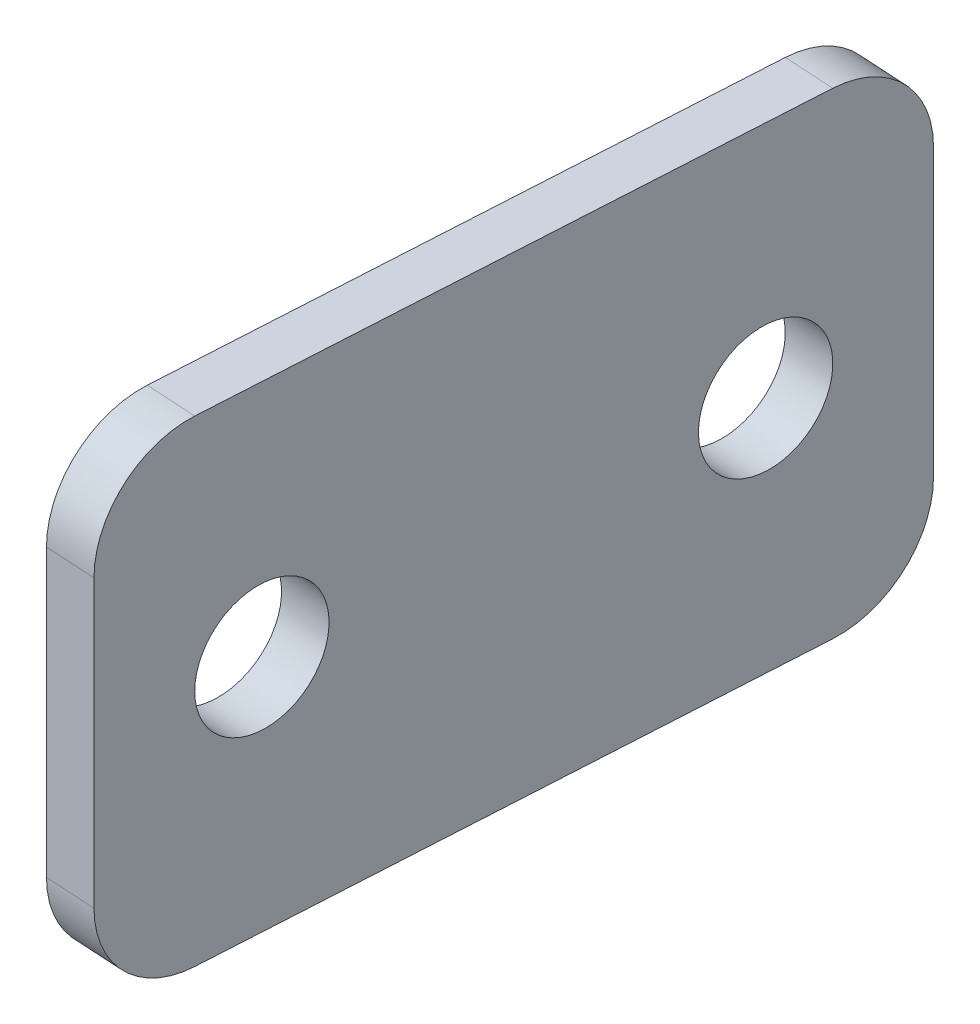
ISO-10303-21;
HEADER;
FILE_DESCRIPTION(('STEP AP214'),'2;1');
FILE_NAME('part.step','',(''),(''),'','','');
FILE_SCHEMA(('AUTOMOTIVE_DESIGN { 1 0 10303 214 1 1 1 1 }'));
ENDSEC;
DATA;
#1=APPLICATION_CONTEXT('core data for automotive mechanical design processes');
#2=APPLICATION_PROTOCOL_DEFINITION('international standard','automotive_design',2000,#1);
#3=PRODUCT_CONTEXT('',#1,'mechanical');
#4=PRODUCT('Part','Part','',(#3));
#5=PRODUCT_RELATED_PRODUCT_CATEGORY('part','',(#4));
#6=PRODUCT_DEFINITION_FORMATION('','',#4);
#7=PRODUCT_DEFINITION_CONTEXT('part definition',#1,'design');
#8=PRODUCT_DEFINITION('design','',#6,#7);
#9=PRODUCT_DEFINITION_SHAPE('','',#8);
#10=(LENGTH_UNIT() NAMED_UNIT(*) SI_UNIT(.MILLI.,.METRE.));
#11=(NAMED_UNIT(*) PLANE_ANGLE_UNIT() SI_UNIT($,.RADIAN.));
#12=(NAMED_UNIT(*) SI_UNIT($,.STERADIAN.) SOLID_ANGLE_UNIT());
#13=UNCERTAINTY_MEASURE_WITH_UNIT(LENGTH_MEASURE(1.E-05),#10,'distance_accuracy_value','');
#14=(GEOMETRIC_REPRESENTATION_CONTEXT(3) GLOBAL_UNCERTAINTY_ASSIGNED_CONTEXT((#13)) GLOBAL_UNIT_ASSIGNED_CONTEXT((#10,
#11,#12)) REPRESENTATION_CONTEXT('',''));
#15=CARTESIAN_POINT('',(0.,0.,0.));
#16=DIRECTION('',(0.,0.,1.));
#17=DIRECTION('',(1.,0.,0.));
#18=AXIS2_PLACEMENT_3D('',#15,#16,#17);
#19=CARTESIAN_POINT('',(434.33990829078,-447.019503363955,-696.124818091149));
#20=DIRECTION('',(-0.998302940921257,0.,-0.0582343382204065));
#21=DIRECTION('',(-0.0582343382204065,0.,0.998302940921257));
#22=AXIS2_PLACEMENT_3D('',#19,#20,#21);
#23=PLANE('',#22);
#24=CARTESIAN_POINT('',(418.058904953613,-451.519503363955,-417.021903739721));
#25=DIRECTION('',(-0.998302940921257,0.,-0.0582343382204065));
#26=DIRECTION('',(-0.0582343382204065,0.,0.998302940921257));
#27=AXIS2_PLACEMENT_3D('',#24,#25,#26);
#28=CIRCLE('',#27,3.);
#29=CARTESIAN_POINT('',(418.058904953613,-454.519503363955,-417.021903739721));
#30=VERTEX_POINT('',#29);
#31=CARTESIAN_POINT('',(417.884201938952,-451.519503363955,-414.026994916957));
#32=VERTEX_POINT('',#31);
#33=EDGE_CURVE('E115',#30,#32,#28,.T.);
#34=ORIENTED_EDGE('',*,*,#33,.F.);
#35=DIRECTION('',(-0.0582343382204181,0.,0.998302940921256));
#36=VECTOR('',#35,1.);
#37=CARTESIAN_POINT('',(419.165357379801,-454.519503363955,-435.989659617225));
#38=LINE('',#37,#36);
#39=CARTESIAN_POINT('',(419.165357379801,-454.519503363955,-435.989659617225));
#40=VERTEX_POINT('',#39);
#41=EDGE_CURVE('E118',#40,#30,#38,.T.);
#42=ORIENTED_EDGE('',*,*,#41,.F.);
#43=CARTESIAN_POINT('',(419.165357379801,-451.519503363955,-435.989659617225));
#44=DIRECTION('',(-0.998302940921257,0.,-0.0582343382204065));
#45=DIRECTION('',(-0.0582343382204065,0.,0.998302940921257));
#46=AXIS2_PLACEMENT_3D('',#43,#44,#45);
#47=CIRCLE('',#46,3.);
#48=CARTESIAN_POINT('',(419.340060394462,-451.519503363955,-438.984568439988));
#49=VERTEX_POINT('',#48);
#50=EDGE_CURVE('E98',#49,#40,#47,.T.);
#51=ORIENTED_EDGE('',*,*,#50,.F.);
#52=DIRECTION('',(0.,1.,0.));
#53=VECTOR('',#52,1.);
#54=CARTESIAN_POINT('',(419.340060394462,-454.519503363955,-438.984568439988));
#55=LINE('',#54,#53);
#56=CARTESIAN_POINT('',(419.340060394462,-442.519503363955,-438.984568439988));
#57=VERTEX_POINT('',#56);
#58=EDGE_CURVE('E94',#57,#49,#55,.F.);
#59=ORIENTED_EDGE('',*,*,#58,.F.);
#60=CARTESIAN_POINT('',(419.165357379801,-442.519503363955,-435.989659617225));
#61=DIRECTION('',(-0.998302940921257,0.,-0.0582343382204065));
#62=DIRECTION('',(-0.0582343382204065,0.,0.998302940921257));
#63=AXIS2_PLACEMENT_3D('',#60,#61,#62);
#64=CIRCLE('',#63,3.);
#65=CARTESIAN_POINT('',(419.165357379801,-439.519503363955,-435.989659617225));
#66=VERTEX_POINT('',#65);
#67=EDGE_CURVE('E83',#66,#57,#64,.T.);
#68=ORIENTED_EDGE('',*,*,#67,.F.);
#69=DIRECTION('',(0.0582343382204181,0.,-0.998302940921256));
#70=VECTOR('',#69,1.);
#71=CARTESIAN_POINT('',(418.058904953613,-439.519503363955,-417.021903739721));
#72=LINE('',#71,#70);
#73=CARTESIAN_POINT('',(418.058904953613,-439.519503363955,-417.021903739721));
#74=VERTEX_POINT('',#73);
#75=EDGE_CURVE('E78',#74,#66,#72,.T.);
#76=ORIENTED_EDGE('',*,*,#75,.F.);
#77=CARTESIAN_POINT('',(418.058904953613,-442.519503363955,-417.021903739721));
#78=DIRECTION('',(0.998302940921257,0.,0.0582343382204065));
#79=DIRECTION('',(0.0582343382204065,0.,-0.998302940921257));
#80=AXIS2_PLACEMENT_3D('',#77,#78,#79);
#81=CIRCLE('',#80,3.);
#82=CARTESIAN_POINT('',(417.884201938952,-442.519503363955,-414.026994916957));
#83=VERTEX_POINT('',#82);
#84=EDGE_CURVE('E138',#83,#74,#81,.F.);
#85=ORIENTED_EDGE('',*,*,#84,.F.);
#86=DIRECTION('',(0.,1.,0.));
#87=VECTOR('',#86,1.);
#88=CARTESIAN_POINT('',(417.884201938952,-439.519503363955,-414.026994916957));
#89=LINE('',#88,#87);
#90=EDGE_CURVE('E112',#32,#83,#89,.T.);
#91=ORIENTED_EDGE('',*,*,#90,.F.);
#92=EDGE_LOOP('',(#34,#42,#51,#59,#68,#76,#85,#91));
#93=FACE_BOUND('',#92,.T.);
#94=CARTESIAN_POINT('',(419.04888870336,-447.019503363955,-433.993053735382));
#95=DIRECTION('',(-0.998302940921257,0.,-0.0582343382204065));
#96=DIRECTION('',(-0.0582343382204065,0.,0.998302940921257));
#97=AXIS2_PLACEMENT_3D('',#94,#95,#96);
#98=CIRCLE('',#97,2.);
#99=CARTESIAN_POINT('',(418.932420026919,-447.019503363955,-431.996447853539));
#100=VERTEX_POINT('',#99);
#101=EDGE_CURVE('E117',#100,#100,#98,.T.);
#102=ORIENTED_EDGE('',*,*,#101,.T.);
#103=EDGE_LOOP('',(#102));
#104=FACE_BOUND('',#103,.T.);
#105=CARTESIAN_POINT('',(418.175373630054,-447.019503363955,-419.018509621563));
#106=DIRECTION('',(-0.998302940921257,0.,-0.0582343382204065));
#107=DIRECTION('',(-0.0582343382204065,0.,0.998302940921257));
#108=AXIS2_PLACEMENT_3D('',#105,#106,#107);
#109=CIRCLE('',#108,2.);
#110=CARTESIAN_POINT('',(418.058904953613,-447.019503363955,-417.02190373972));
#111=VERTEX_POINT('',#110);
#112=EDGE_CURVE('E20',#111,#111,#109,.T.);
#113=ORIENTED_EDGE('',*,*,#112,.T.);
#114=EDGE_LOOP('',(#113));
#115=FACE_BOUND('',#114,.T.);
#116=ADVANCED_FACE('F17',(#93,#104,#115),#23,.F.);
#117=CARTESIAN_POINT('',(418.175373630054,-447.019503363955,-419.018509621563));
#118=DIRECTION('',(-0.998302940921257,0.,-0.0582343382204065));
#119=DIRECTION('',(-0.0582343382204065,0.,0.998302940921257));
#120=AXIS2_PLACEMENT_3D('',#117,#118,#119);
#121=CYLINDRICAL_SURFACE('',#120,2.);
#122=ORIENTED_EDGE('',*,*,#112,.F.);
#123=EDGE_LOOP('',(#122));
#124=FACE_BOUND('',#123,.T.);
#125=CARTESIAN_POINT('',(416.588071953989,-447.019503363955,-419.111102219333));
#126=DIRECTION('',(-0.998302940921257,0.,-0.0582343382204065));
#127=DIRECTION('',(-0.0582343382204065,0.,0.998302940921257));
#128=AXIS2_PLACEMENT_3D('',#125,#126,#127);
#129=CIRCLE('',#128,2.);
#130=CARTESIAN_POINT('',(416.471603277548,-447.019503363955,-417.114496337491));
#131=VERTEX_POINT('',#130);
#132=EDGE_CURVE('E135',#131,#131,#129,.F.);
#133=ORIENTED_EDGE('',*,*,#132,.F.);
#134=EDGE_LOOP('',(#133));
#135=FACE_BOUND('',#134,.T.);
#136=ADVANCED_FACE('F149',(#124,#135),#121,.F.);
#137=CARTESIAN_POINT('',(419.04888870336,-447.019503363955,-433.993053735382));
#138=DIRECTION('',(-0.998302940921257,0.,-0.0582343382204065));
#139=DIRECTION('',(-0.0582343382204065,0.,0.998302940921257));
#140=AXIS2_PLACEMENT_3D('',#137,#138,#139);
#141=CYLINDRICAL_SURFACE('',#140,2.);
#142=ORIENTED_EDGE('',*,*,#101,.F.);
#143=EDGE_LOOP('',(#142));
#144=FACE_BOUND('',#143,.T.);
#145=CARTESIAN_POINT('',(417.461587027295,-447.019503363955,-434.085646333152));
#146=DIRECTION('',(-0.998302940921257,0.,-0.0582343382204065));
#147=DIRECTION('',(-0.0582343382204065,0.,0.998302940921257));
#148=AXIS2_PLACEMENT_3D('',#145,#146,#147);
#149=CIRCLE('',#148,2.);
#150=CARTESIAN_POINT('',(417.345118350854,-447.019503363955,-432.08904045131));
#151=VERTEX_POINT('',#150);
#152=EDGE_CURVE('E132',#151,#151,#149,.F.);
#153=ORIENTED_EDGE('',*,*,#152,.F.);
#154=EDGE_LOOP('',(#153));
#155=FACE_BOUND('',#154,.T.);
#156=ADVANCED_FACE('F152',(#144,#155),#141,.F.);
#157=CARTESIAN_POINT('',(419.340060394462,-439.519503363955,-438.984568439988));
#158=DIRECTION('',(0.,1.,0.));
#159=DIRECTION('',(0.,0.,1.));
#160=AXIS2_PLACEMENT_3D('',#157,#158,#159);
#161=PLANE('',#160);
#162=DIRECTION('',(-0.998302940921257,0.,-0.0582343382204065));
#163=VECTOR('',#162,1.);
#164=CARTESIAN_POINT('',(419.165357379801,-439.519503363955,-435.989659617225));
#165=LINE('',#164,#163);
#166=CARTESIAN_POINT('',(417.578055703736,-439.519503363955,-436.082252214995));
#167=VERTEX_POINT('',#166);
#168=EDGE_CURVE('E90',#167,#66,#165,.F.);
#169=ORIENTED_EDGE('',*,*,#168,.F.);
#170=DIRECTION('',(-0.0582343382204065,0.,0.998302940921257));
#171=VECTOR('',#170,1.);
#172=CARTESIAN_POINT('',(432.752606614715,-439.519503363955,-696.217410688919));
#173=LINE('',#172,#171);
#174=CARTESIAN_POINT('',(416.471603277549,-439.519503363955,-417.114496337491));
#175=VERTEX_POINT('',#174);
#176=EDGE_CURVE('E131',#175,#167,#173,.F.);
#177=ORIENTED_EDGE('',*,*,#176,.F.);
#178=DIRECTION('',(0.998302940921257,0.,0.0582343382204065));
#179=VECTOR('',#178,1.);
#180=CARTESIAN_POINT('',(418.058904953613,-439.519503363955,-417.021903739721));
#181=LINE('',#180,#179);
#182=EDGE_CURVE('E279',#74,#175,#181,.F.);
#183=ORIENTED_EDGE('',*,*,#182,.F.);
#184=ORIENTED_EDGE('',*,*,#75,.T.);
#185=EDGE_LOOP('',(#169,#177,#183,#184));
#186=FACE_BOUND('',#185,.T.);
#187=ADVANCED_FACE('F188',(#186),#161,.T.);
#188=CARTESIAN_POINT('',(419.165357379801,-442.519503363955,-435.989659617225));
#189=DIRECTION('',(-0.998302940921257,0.,-0.0582343382204065));
#190=DIRECTION('',(-0.0582343382204065,0.,0.998302940921257));
#191=AXIS2_PLACEMENT_3D('',#188,#189,#190);
#192=CYLINDRICAL_SURFACE('',#191,3.);
#193=DIRECTION('',(-0.998302940921257,0.,-0.0582343382204065));
#194=VECTOR('',#193,1.);
#195=CARTESIAN_POINT('',(419.340060394462,-442.519503363955,-438.984568439988));
#196=LINE('',#195,#194);
#197=CARTESIAN_POINT('',(417.752758718398,-442.519503363955,-439.077161037759));
#198=VERTEX_POINT('',#197);
#199=EDGE_CURVE('E88',#198,#57,#196,.F.);
#200=ORIENTED_EDGE('',*,*,#199,.F.);
#201=CARTESIAN_POINT('',(417.578055703737,-442.519503363955,-436.082252214995));
#202=DIRECTION('',(-0.998302940921257,0.,-0.0582343382204065));
#203=DIRECTION('',(-0.0582343382204065,0.,0.998302940921257));
#204=AXIS2_PLACEMENT_3D('',#201,#202,#203);
#205=CIRCLE('',#204,3.);
#206=EDGE_CURVE('E129',#167,#198,#205,.T.);
#207=ORIENTED_EDGE('',*,*,#206,.F.);
#208=ORIENTED_EDGE('',*,*,#168,.T.);
#209=ORIENTED_EDGE('',*,*,#67,.T.);
#210=EDGE_LOOP('',(#200,#207,#208,#209));
#211=FACE_BOUND('',#210,.T.);
#212=ADVANCED_FACE('F85',(#211),#192,.T.);
#213=CARTESIAN_POINT('',(419.340060394462,-454.519503363955,-438.984568439988));
#214=DIRECTION('',(0.0582343382204065,0.,-0.998302940921257));
#215=DIRECTION('',(-0.998302940921257,0.,-0.0582343382204065));
#216=AXIS2_PLACEMENT_3D('',#213,#214,#215);
#217=PLANE('',#216);
#218=ORIENTED_EDGE('',*,*,#199,.T.);
#219=ORIENTED_EDGE('',*,*,#58,.T.);
#220=DIRECTION('',(-0.998302940921257,0.,-0.0582343382204065));
#221=VECTOR('',#220,1.);
#222=CARTESIAN_POINT('',(419.340060394462,-451.519503363955,-438.984568439989));
#223=LINE('',#222,#221);
#224=CARTESIAN_POINT('',(417.752758718397,-451.519503363955,-439.077161037759));
#225=VERTEX_POINT('',#224);
#226=EDGE_CURVE('E101',#225,#49,#223,.F.);
#227=ORIENTED_EDGE('',*,*,#226,.F.);
#228=DIRECTION('',(0.,1.,0.));
#229=VECTOR('',#228,1.);
#230=CARTESIAN_POINT('',(417.752758718397,-447.019503363955,-439.077161037759));
#231=LINE('',#230,#229);
#232=EDGE_CURVE('E105',#198,#225,#231,.F.);
#233=ORIENTED_EDGE('',*,*,#232,.F.);
#234=EDGE_LOOP('',(#218,#219,#227,#233));
#235=FACE_BOUND('',#234,.T.);
#236=ADVANCED_FACE('F103',(#235),#217,.T.);
#237=CARTESIAN_POINT('',(419.165357379801,-451.519503363955,-435.989659617225));
#238=DIRECTION('',(-0.998302940921257,0.,-0.0582343382204065));
#239=DIRECTION('',(-0.0582343382204065,0.,0.998302940921257));
#240=AXIS2_PLACEMENT_3D('',#237,#238,#239);
#241=CYLINDRICAL_SURFACE('',#240,3.);
#242=DIRECTION('',(0.998302940921276,0.,0.0582343382200874));
#243=VECTOR('',#242,1.);
#244=CARTESIAN_POINT('',(417.578055703736,-454.519503363955,-436.082252214995));
#245=LINE('',#244,#243);
#246=CARTESIAN_POINT('',(417.578055703736,-454.519503363955,-436.082252214995));
#247=VERTEX_POINT('',#246);
#248=EDGE_CURVE('E120',#247,#40,#245,.T.);
#249=ORIENTED_EDGE('',*,*,#248,.F.);
#250=CARTESIAN_POINT('',(417.578055703736,-451.519503363955,-436.082252214995));
#251=DIRECTION('',(-0.998302940921257,0.,-0.0582343382204065));
#252=DIRECTION('',(-0.0582343382204065,0.,0.998302940921257));
#253=AXIS2_PLACEMENT_3D('',#250,#251,#252);
#254=CIRCLE('',#253,3.);
#255=EDGE_CURVE('E126',#225,#247,#254,.T.);
#256=ORIENTED_EDGE('',*,*,#255,.F.);
#257=ORIENTED_EDGE('',*,*,#226,.T.);
#258=ORIENTED_EDGE('',*,*,#50,.T.);
#259=EDGE_LOOP('',(#249,#256,#257,#258));
#260=FACE_BOUND('',#259,.T.);
#261=ADVANCED_FACE('F179',(#260),#241,.T.);
#262=CARTESIAN_POINT('',(417.884201938952,-454.519503363955,-414.026994916957));
#263=DIRECTION('',(0.,-1.,0.));
#264=DIRECTION('',(0.,0.,-1.));
#265=AXIS2_PLACEMENT_3D('',#262,#263,#264);
#266=PLANE('',#265);
#267=ORIENTED_EDGE('',*,*,#248,.T.);
#268=ORIENTED_EDGE('',*,*,#41,.T.);
#269=DIRECTION('',(-0.998302940921257,0.,-0.0582343382204065));
#270=VECTOR('',#269,1.);
#271=CARTESIAN_POINT('',(418.058904953613,-454.519503363955,-417.021903739721));
#272=LINE('',#271,#270);
#273=CARTESIAN_POINT('',(416.471603277548,-454.519503363955,-417.114496337491));
#274=VERTEX_POINT('',#273);
#275=EDGE_CURVE('E119',#274,#30,#272,.F.);
#276=ORIENTED_EDGE('',*,*,#275,.F.);
#277=DIRECTION('',(-0.0582343382204065,0.,0.998302940921257));
#278=VECTOR('',#277,1.);
#279=CARTESIAN_POINT('',(432.752606614715,-454.519503363955,-696.217410688919));
#280=LINE('',#279,#278);
#281=EDGE_CURVE('E125',#247,#274,#280,.T.);
#282=ORIENTED_EDGE('',*,*,#281,.F.);
#283=EDGE_LOOP('',(#267,#268,#276,#282));
#284=FACE_BOUND('',#283,.T.);
#285=ADVANCED_FACE('F175',(#284),#266,.T.);
#286=CARTESIAN_POINT('',(418.058904953613,-451.519503363955,-417.021903739721));
#287=DIRECTION('',(-0.998302940921257,0.,-0.0582343382204065));
#288=DIRECTION('',(-0.0582343382204065,0.,0.998302940921257));
#289=AXIS2_PLACEMENT_3D('',#286,#287,#288);
#290=CYLINDRICAL_SURFACE('',#289,3.);
#291=DIRECTION('',(0.998302940921257,0.,0.0582343382204065));
#292=VECTOR('',#291,1.);
#293=CARTESIAN_POINT('',(417.884201938952,-451.519503363955,-414.026994916957));
#294=LINE('',#293,#292);
#295=CARTESIAN_POINT('',(416.296900262887,-451.519503363955,-414.119587514727));
#296=VERTEX_POINT('',#295);
#297=EDGE_CURVE('E114',#296,#32,#294,.T.);
#298=ORIENTED_EDGE('',*,*,#297,.F.);
#299=CARTESIAN_POINT('',(416.471603277548,-451.519503363955,-417.114496337491));
#300=DIRECTION('',(-0.998302940921257,0.,-0.0582343382204065));
#301=DIRECTION('',(-0.0582343382204065,0.,0.998302940921257));
#302=AXIS2_PLACEMENT_3D('',#299,#300,#301);
#303=CIRCLE('',#302,3.);
#304=EDGE_CURVE('E122',#274,#296,#303,.T.);
#305=ORIENTED_EDGE('',*,*,#304,.F.);
#306=ORIENTED_EDGE('',*,*,#275,.T.);
#307=ORIENTED_EDGE('',*,*,#33,.T.);
#308=EDGE_LOOP('',(#298,#305,#306,#307));
#309=FACE_BOUND('',#308,.T.);
#310=ADVANCED_FACE('F172',(#309),#290,.T.);
#311=CARTESIAN_POINT('',(417.884201938952,-439.519503363955,-414.026994916957));
#312=DIRECTION('',(-0.0582343382204065,0.,0.998302940921257));
#313=DIRECTION('',(0.998302940921257,0.,0.0582343382204065));
#314=AXIS2_PLACEMENT_3D('',#311,#312,#313);
#315=PLANE('',#314);
#316=DIRECTION('',(0.,1.,0.));
#317=VECTOR('',#316,1.);
#318=CARTESIAN_POINT('',(416.296900262887,-447.019503363955,-414.119587514727));
#319=LINE('',#318,#317);
#320=CARTESIAN_POINT('',(416.296900262888,-442.519503363955,-414.119587514727));
#321=VERTEX_POINT('',#320);
#322=EDGE_CURVE('E26',#296,#321,#319,.T.);
#323=ORIENTED_EDGE('',*,*,#322,.F.);
#324=ORIENTED_EDGE('',*,*,#297,.T.);
#325=ORIENTED_EDGE('',*,*,#90,.T.);
#326=DIRECTION('',(0.998302940921257,0.,0.0582343382204065));
#327=VECTOR('',#326,1.);
#328=CARTESIAN_POINT('',(417.884201938952,-442.519503363955,-414.026994916957));
#329=LINE('',#328,#327);
#330=EDGE_CURVE('E35',#321,#83,#329,.T.);
#331=ORIENTED_EDGE('',*,*,#330,.F.);
#332=EDGE_LOOP('',(#323,#324,#325,#331));
#333=FACE_BOUND('',#332,.T.);
#334=ADVANCED_FACE('F164',(#333),#315,.T.);
#335=CARTESIAN_POINT('',(418.058904953613,-442.519503363955,-417.021903739721));
#336=DIRECTION('',(0.998302940921257,0.,0.0582343382204065));
#337=DIRECTION('',(0.0582343382204065,0.,-0.998302940921257));
#338=AXIS2_PLACEMENT_3D('',#335,#336,#337);
#339=CYLINDRICAL_SURFACE('',#338,3.);
#340=ORIENTED_EDGE('',*,*,#330,.T.);
#341=ORIENTED_EDGE('',*,*,#84,.T.);
#342=ORIENTED_EDGE('',*,*,#182,.T.);
#343=CARTESIAN_POINT('',(416.471603277549,-442.519503363955,-417.114496337491));
#344=DIRECTION('',(0.998302940921257,0.,0.0582343382204065));
#345=DIRECTION('',(0.0582343382204065,0.,-0.998302940921257));
#346=AXIS2_PLACEMENT_3D('',#343,#344,#345);
#347=CIRCLE('',#346,3.);
#348=EDGE_CURVE('E11',#321,#175,#347,.F.);
#349=ORIENTED_EDGE('',*,*,#348,.F.);
#350=EDGE_LOOP('',(#340,#341,#342,#349));
#351=FACE_BOUND('',#350,.T.);
#352=ADVANCED_FACE('F157',(#351),#339,.T.);
#353=CARTESIAN_POINT('',(432.752606614715,-447.019503363955,-696.217410688919));
#354=DIRECTION('',(-0.998302940921257,0.,-0.0582343382204065));
#355=DIRECTION('',(-0.0582343382204065,0.,0.998302940921257));
#356=AXIS2_PLACEMENT_3D('',#353,#354,#355);
#357=PLANE('',#356);
#358=ORIENTED_EDGE('',*,*,#322,.T.);
#359=ORIENTED_EDGE('',*,*,#348,.T.);
#360=ORIENTED_EDGE('',*,*,#176,.T.);
#361=ORIENTED_EDGE('',*,*,#206,.T.);
#362=ORIENTED_EDGE('',*,*,#232,.T.);
#363=ORIENTED_EDGE('',*,*,#255,.T.);
#364=ORIENTED_EDGE('',*,*,#281,.T.);
#365=ORIENTED_EDGE('',*,*,#304,.T.);
#366=EDGE_LOOP('',(#358,#359,#360,#361,#362,#363,#364,#365));
#367=FACE_BOUND('',#366,.T.);
#368=ORIENTED_EDGE('',*,*,#152,.T.);
#369=EDGE_LOOP('',(#368));
#370=FACE_BOUND('',#369,.T.);
#371=ORIENTED_EDGE('',*,*,#132,.T.);
#372=EDGE_LOOP('',(#371));
#373=FACE_BOUND('',#372,.T.);
#374=ADVANCED_FACE('F155',(#367,#370,#373),#357,.T.);
#375=CLOSED_SHELL('',(#116,#136,#156,#187,#212,#236,#261,#285,#310,#334,#352,#374));
#376=MANIFOLD_SOLID_BREP('B1',#375);
#377=ADVANCED_BREP_SHAPE_REPRESENTATION('',(#18,#376),#14);
#378=SHAPE_DEFINITION_REPRESENTATION(#9,#377);
ENDSEC;
END-ISO-10303-21;
